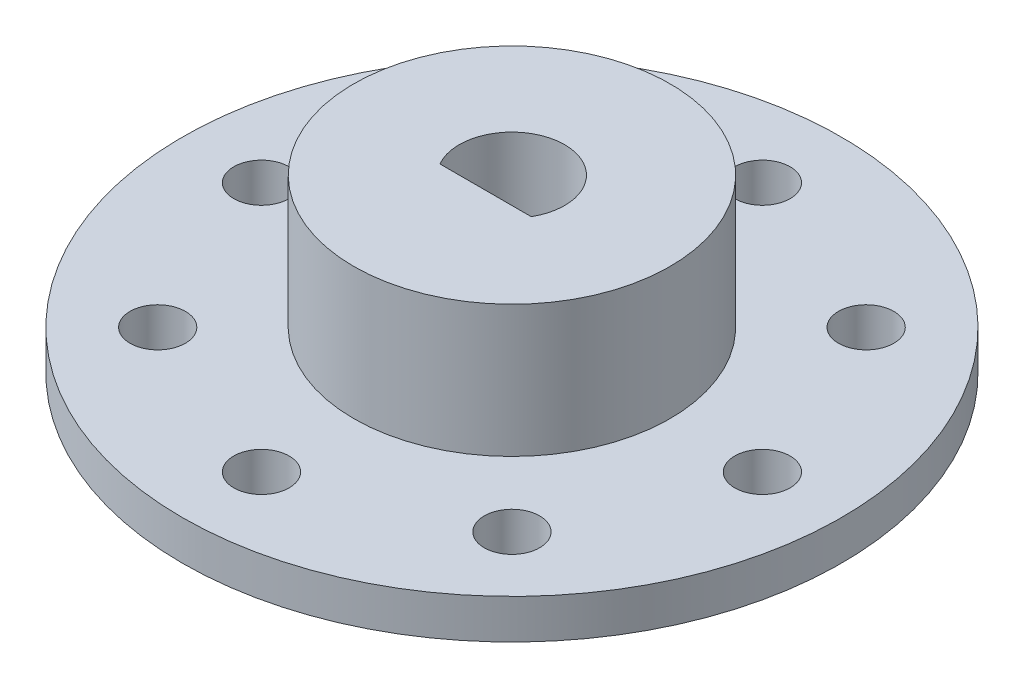
ISO-10303-21;
HEADER;
FILE_DESCRIPTION(('STEP AP214'),'2;1');
FILE_NAME('part.step','',(''),(''),'','','');
FILE_SCHEMA(('AUTOMOTIVE_DESIGN { 1 0 10303 214 1 1 1 1 }'));
ENDSEC;
DATA;
#1=APPLICATION_CONTEXT('core data for automotive mechanical design processes');
#2=APPLICATION_PROTOCOL_DEFINITION('international standard','automotive_design',2000,#1);
#3=PRODUCT_CONTEXT('',#1,'mechanical');
#4=PRODUCT('Part','Part','',(#3));
#5=PRODUCT_RELATED_PRODUCT_CATEGORY('part','',(#4));
#6=PRODUCT_DEFINITION_FORMATION('','',#4);
#7=PRODUCT_DEFINITION_CONTEXT('part definition',#1,'design');
#8=PRODUCT_DEFINITION('design','',#6,#7);
#9=PRODUCT_DEFINITION_SHAPE('','',#8);
#10=(LENGTH_UNIT() NAMED_UNIT(*) SI_UNIT(.MILLI.,.METRE.));
#11=(NAMED_UNIT(*) PLANE_ANGLE_UNIT() SI_UNIT($,.RADIAN.));
#12=(NAMED_UNIT(*) SI_UNIT($,.STERADIAN.) SOLID_ANGLE_UNIT());
#13=UNCERTAINTY_MEASURE_WITH_UNIT(LENGTH_MEASURE(1.E-05),#10,'distance_accuracy_value','');
#14=(GEOMETRIC_REPRESENTATION_CONTEXT(3) GLOBAL_UNCERTAINTY_ASSIGNED_CONTEXT((#13)) GLOBAL_UNIT_ASSIGNED_CONTEXT((#10,
#11,#12)) REPRESENTATION_CONTEXT('',''));
#15=CARTESIAN_POINT('',(0.,0.,0.));
#16=DIRECTION('',(0.,0.,1.));
#17=DIRECTION('',(1.,0.,0.));
#18=AXIS2_PLACEMENT_3D('',#15,#16,#17);
#19=CARTESIAN_POINT('',(0.,3.,0.));
#20=DIRECTION('',(0.,1.,0.));
#21=DIRECTION('',(0.,0.,1.));
#22=AXIS2_PLACEMENT_3D('',#19,#20,#21);
#23=PLANE('',#22);
#24=CARTESIAN_POINT('',(-13.4350288425442,3.,-13.4350288425438));
#25=DIRECTION('',(0.,1.,0.));
#26=DIRECTION('',(0.,0.,1.));
#27=AXIS2_PLACEMENT_3D('',#24,#25,#26);
#28=CIRCLE('',#27,2.10000000000062);
#29=CARTESIAN_POINT('',(-13.4350288425442,3.,-11.3350288425432));
#30=VERTEX_POINT('',#29);
#31=EDGE_CURVE('E101',#30,#30,#28,.T.);
#32=ORIENTED_EDGE('',*,*,#31,.F.);
#33=EDGE_LOOP('',(#32));
#34=FACE_BOUND('',#33,.T.);
#35=CARTESIAN_POINT('',(-13.435028842543,3.,13.435028842545));
#36=DIRECTION('',(0.,1.,0.));
#37=DIRECTION('',(0.,0.,1.));
#38=AXIS2_PLACEMENT_3D('',#35,#36,#37);
#39=CIRCLE('',#38,2.10000000000164);
#40=CARTESIAN_POINT('',(-13.435028842543,3.,15.5350288425466));
#41=VERTEX_POINT('',#40);
#42=EDGE_CURVE('E117',#41,#41,#39,.T.);
#43=ORIENTED_EDGE('',*,*,#42,.F.);
#44=EDGE_LOOP('',(#43));
#45=FACE_BOUND('',#44,.T.);
#46=CARTESIAN_POINT('',(13.4350288425458,3.,13.4350288425438));
#47=DIRECTION('',(0.,1.,0.));
#48=DIRECTION('',(0.,0.,1.));
#49=AXIS2_PLACEMENT_3D('',#46,#47,#48);
#50=CIRCLE('',#49,2.10000000000125);
#51=CARTESIAN_POINT('',(13.4350288425458,3.,15.5350288425451));
#52=VERTEX_POINT('',#51);
#53=EDGE_CURVE('E133',#52,#52,#50,.T.);
#54=ORIENTED_EDGE('',*,*,#53,.F.);
#55=EDGE_LOOP('',(#54));
#56=FACE_BOUND('',#55,.T.);
#57=CARTESIAN_POINT('',(13.4350288425446,3.,-13.435028842545));
#58=DIRECTION('',(0.,1.,0.));
#59=DIRECTION('',(0.,0.,1.));
#60=AXIS2_PLACEMENT_3D('',#57,#58,#59);
#61=CIRCLE('',#60,2.1000000000001);
#62=CARTESIAN_POINT('',(13.4350288425446,3.,-11.3350288425449));
#63=VERTEX_POINT('',#62);
#64=EDGE_CURVE('E149',#63,#63,#61,.T.);
#65=ORIENTED_EDGE('',*,*,#64,.F.);
#66=EDGE_LOOP('',(#65));
#67=FACE_BOUND('',#66,.T.);
#68=CARTESIAN_POINT('',(0.,3.,0.));
#69=DIRECTION('',(0.,1.,0.));
#70=DIRECTION('',(0.,0.,1.));
#71=AXIS2_PLACEMENT_3D('',#68,#69,#70);
#72=CIRCLE('',#71,25.);
#73=CARTESIAN_POINT('',(0.,3.,25.));
#74=VERTEX_POINT('',#73);
#75=EDGE_CURVE('E11',#74,#74,#72,.T.);
#76=ORIENTED_EDGE('',*,*,#75,.T.);
#77=EDGE_LOOP('',(#76));
#78=FACE_BOUND('',#77,.T.);
#79=CARTESIAN_POINT('',(0.,3.,-19.));
#80=DIRECTION('',(0.,1.,0.));
#81=DIRECTION('',(0.,0.,1.));
#82=AXIS2_PLACEMENT_3D('',#79,#80,#81);
#83=CIRCLE('',#82,2.1);
#84=CARTESIAN_POINT('',(0.,3.,-16.9));
#85=VERTEX_POINT('',#84);
#86=EDGE_CURVE('E157',#85,#85,#83,.T.);
#87=ORIENTED_EDGE('',*,*,#86,.F.);
#88=EDGE_LOOP('',(#87));
#89=FACE_BOUND('',#88,.T.);
#90=CARTESIAN_POINT('',(19.0000000000008,3.,-8.07691889848134E-13));
#91=DIRECTION('',(0.,1.,0.));
#92=DIRECTION('',(0.,0.,1.));
#93=AXIS2_PLACEMENT_3D('',#90,#91,#92);
#94=CIRCLE('',#93,2.1000000000006);
#95=CARTESIAN_POINT('',(19.0000000000008,3.,2.09999999999979));
#96=VERTEX_POINT('',#95);
#97=EDGE_CURVE('E141',#96,#96,#94,.T.);
#98=ORIENTED_EDGE('',*,*,#97,.F.);
#99=EDGE_LOOP('',(#98));
#100=FACE_BOUND('',#99,.T.);
#101=CARTESIAN_POINT('',(1.61538377969627E-12,3.,19.));
#102=DIRECTION('',(0.,1.,0.));
#103=DIRECTION('',(0.,0.,1.));
#104=AXIS2_PLACEMENT_3D('',#101,#102,#103);
#105=CIRCLE('',#104,2.10000000000167);
#106=CARTESIAN_POINT('',(1.61538377969627E-12,3.,21.1000000000017));
#107=VERTEX_POINT('',#106);
#108=EDGE_CURVE('E125',#107,#107,#105,.T.);
#109=ORIENTED_EDGE('',*,*,#108,.F.);
#110=EDGE_LOOP('',(#109));
#111=FACE_BOUND('',#110,.T.);
#112=CARTESIAN_POINT('',(-18.9999999999992,3.,8.10018718766514E-13));
#113=DIRECTION('',(0.,1.,0.));
#114=DIRECTION('',(0.,0.,1.));
#115=AXIS2_PLACEMENT_3D('',#112,#113,#114);
#116=CIRCLE('',#115,2.1000000000012);
#117=CARTESIAN_POINT('',(-18.9999999999992,3.,2.10000000000201));
#118=VERTEX_POINT('',#117);
#119=EDGE_CURVE('E109',#118,#118,#116,.T.);
#120=ORIENTED_EDGE('',*,*,#119,.F.);
#121=EDGE_LOOP('',(#120));
#122=FACE_BOUND('',#121,.T.);
#123=CARTESIAN_POINT('',(0.,3.,0.));
#124=DIRECTION('',(0.,1.,0.));
#125=DIRECTION('',(0.,0.,1.));
#126=AXIS2_PLACEMENT_3D('',#123,#124,#125);
#127=CIRCLE('',#126,12.);
#128=CARTESIAN_POINT('',(0.,3.,12.));
#129=VERTEX_POINT('',#128);
#130=EDGE_CURVE('E74',#129,#129,#127,.T.);
#131=ORIENTED_EDGE('',*,*,#130,.F.);
#132=EDGE_LOOP('',(#131));
#133=FACE_BOUND('',#132,.T.);
#134=ADVANCED_FACE('F39',(#34,#45,#56,#67,#78,#89,#100,#111,#122,#133),#23,.T.);
#135=CARTESIAN_POINT('',(0.,0.,0.));
#136=DIRECTION('',(0.,1.,0.));
#137=DIRECTION('',(0.,0.,1.));
#138=AXIS2_PLACEMENT_3D('',#135,#136,#137);
#139=PLANE('',#138);
#140=DIRECTION('',(1.,0.,0.));
#141=VECTOR('',#140,1.);
#142=CARTESIAN_POINT('',(0.,0.,2.));
#143=LINE('',#142,#141);
#144=CARTESIAN_POINT('',(-3.46410161513775,0.,2.));
#145=VERTEX_POINT('',#144);
#146=CARTESIAN_POINT('',(3.46410161513775,0.,2.));
#147=VERTEX_POINT('',#146);
#148=EDGE_CURVE('E76',#145,#147,#143,.T.);
#149=ORIENTED_EDGE('',*,*,#148,.T.);
#150=CARTESIAN_POINT('',(0.,0.,0.));
#151=DIRECTION('',(0.,1.,0.));
#152=DIRECTION('',(0.,0.,1.));
#153=AXIS2_PLACEMENT_3D('',#150,#151,#152);
#154=CIRCLE('',#153,4.);
#155=EDGE_CURVE('E68',#147,#145,#154,.T.);
#156=ORIENTED_EDGE('',*,*,#155,.T.);
#157=EDGE_LOOP('',(#149,#156));
#158=FACE_BOUND('',#157,.T.);
#159=CARTESIAN_POINT('',(0.,0.,0.));
#160=DIRECTION('',(0.,1.,0.));
#161=DIRECTION('',(0.,0.,1.));
#162=AXIS2_PLACEMENT_3D('',#159,#160,#161);
#163=CIRCLE('',#162,25.);
#164=CARTESIAN_POINT('',(0.,0.,25.));
#165=VERTEX_POINT('',#164);
#166=EDGE_CURVE('E43',#165,#165,#163,.T.);
#167=ORIENTED_EDGE('',*,*,#166,.F.);
#168=EDGE_LOOP('',(#167));
#169=FACE_BOUND('',#168,.T.);
#170=CARTESIAN_POINT('',(0.,0.,-19.));
#171=DIRECTION('',(0.,1.,0.));
#172=DIRECTION('',(0.,0.,1.));
#173=AXIS2_PLACEMENT_3D('',#170,#171,#172);
#174=CIRCLE('',#173,2.1);
#175=CARTESIAN_POINT('',(0.,0.,-16.9));
#176=VERTEX_POINT('',#175);
#177=EDGE_CURVE('E153',#176,#176,#174,.T.);
#178=ORIENTED_EDGE('',*,*,#177,.T.);
#179=EDGE_LOOP('',(#178));
#180=FACE_BOUND('',#179,.T.);
#181=CARTESIAN_POINT('',(13.4350288425446,0.,-13.435028842545));
#182=DIRECTION('',(0.,1.,0.));
#183=DIRECTION('',(0.,0.,1.));
#184=AXIS2_PLACEMENT_3D('',#181,#182,#183);
#185=CIRCLE('',#184,2.1000000000001);
#186=CARTESIAN_POINT('',(13.4350288425446,0.,-11.3350288425449));
#187=VERTEX_POINT('',#186);
#188=EDGE_CURVE('E145',#187,#187,#185,.T.);
#189=ORIENTED_EDGE('',*,*,#188,.T.);
#190=EDGE_LOOP('',(#189));
#191=FACE_BOUND('',#190,.T.);
#192=CARTESIAN_POINT('',(19.0000000000008,0.,-8.07691889848134E-13));
#193=DIRECTION('',(0.,1.,0.));
#194=DIRECTION('',(0.,0.,1.));
#195=AXIS2_PLACEMENT_3D('',#192,#193,#194);
#196=CIRCLE('',#195,2.1000000000006);
#197=CARTESIAN_POINT('',(19.0000000000008,0.,2.09999999999979));
#198=VERTEX_POINT('',#197);
#199=EDGE_CURVE('E137',#198,#198,#196,.T.);
#200=ORIENTED_EDGE('',*,*,#199,.T.);
#201=EDGE_LOOP('',(#200));
#202=FACE_BOUND('',#201,.T.);
#203=CARTESIAN_POINT('',(13.4350288425458,0.,13.4350288425438));
#204=DIRECTION('',(0.,1.,0.));
#205=DIRECTION('',(0.,0.,1.));
#206=AXIS2_PLACEMENT_3D('',#203,#204,#205);
#207=CIRCLE('',#206,2.10000000000125);
#208=CARTESIAN_POINT('',(13.4350288425458,0.,15.5350288425451));
#209=VERTEX_POINT('',#208);
#210=EDGE_CURVE('E129',#209,#209,#207,.T.);
#211=ORIENTED_EDGE('',*,*,#210,.T.);
#212=EDGE_LOOP('',(#211));
#213=FACE_BOUND('',#212,.T.);
#214=CARTESIAN_POINT('',(1.61538377969627E-12,0.,19.));
#215=DIRECTION('',(0.,1.,0.));
#216=DIRECTION('',(0.,0.,1.));
#217=AXIS2_PLACEMENT_3D('',#214,#215,#216);
#218=CIRCLE('',#217,2.10000000000167);
#219=CARTESIAN_POINT('',(1.61538377969627E-12,0.,21.1000000000017));
#220=VERTEX_POINT('',#219);
#221=EDGE_CURVE('E121',#220,#220,#218,.T.);
#222=ORIENTED_EDGE('',*,*,#221,.T.);
#223=EDGE_LOOP('',(#222));
#224=FACE_BOUND('',#223,.T.);
#225=CARTESIAN_POINT('',(-13.435028842543,0.,13.435028842545));
#226=DIRECTION('',(0.,1.,0.));
#227=DIRECTION('',(0.,0.,1.));
#228=AXIS2_PLACEMENT_3D('',#225,#226,#227);
#229=CIRCLE('',#228,2.10000000000164);
#230=CARTESIAN_POINT('',(-13.435028842543,0.,15.5350288425466));
#231=VERTEX_POINT('',#230);
#232=EDGE_CURVE('E113',#231,#231,#229,.T.);
#233=ORIENTED_EDGE('',*,*,#232,.T.);
#234=EDGE_LOOP('',(#233));
#235=FACE_BOUND('',#234,.T.);
#236=CARTESIAN_POINT('',(-18.9999999999992,0.,8.10018718766514E-13));
#237=DIRECTION('',(0.,1.,0.));
#238=DIRECTION('',(0.,0.,1.));
#239=AXIS2_PLACEMENT_3D('',#236,#237,#238);
#240=CIRCLE('',#239,2.1000000000012);
#241=CARTESIAN_POINT('',(-18.9999999999992,0.,2.10000000000201));
#242=VERTEX_POINT('',#241);
#243=EDGE_CURVE('E105',#242,#242,#240,.T.);
#244=ORIENTED_EDGE('',*,*,#243,.T.);
#245=EDGE_LOOP('',(#244));
#246=FACE_BOUND('',#245,.T.);
#247=CARTESIAN_POINT('',(-13.4350288425442,0.,-13.4350288425438));
#248=DIRECTION('',(0.,1.,0.));
#249=DIRECTION('',(0.,0.,1.));
#250=AXIS2_PLACEMENT_3D('',#247,#248,#249);
#251=CIRCLE('',#250,2.10000000000062);
#252=CARTESIAN_POINT('',(-13.4350288425442,0.,-11.3350288425432));
#253=VERTEX_POINT('',#252);
#254=EDGE_CURVE('E97',#253,#253,#251,.T.);
#255=ORIENTED_EDGE('',*,*,#254,.T.);
#256=EDGE_LOOP('',(#255));
#257=FACE_BOUND('',#256,.T.);
#258=ADVANCED_FACE('F81',(#158,#169,#180,#191,#202,#213,#224,#235,#246,#257),#139,.F.);
#259=CARTESIAN_POINT('',(0.,3.,0.));
#260=DIRECTION('',(0.,-1.,0.));
#261=DIRECTION('',(0.,0.,-1.));
#262=AXIS2_PLACEMENT_3D('',#259,#260,#261);
#263=CYLINDRICAL_SURFACE('',#262,25.);
#264=ORIENTED_EDGE('',*,*,#75,.F.);
#265=EDGE_LOOP('',(#264));
#266=FACE_BOUND('',#265,.T.);
#267=ORIENTED_EDGE('',*,*,#166,.T.);
#268=EDGE_LOOP('',(#267));
#269=FACE_BOUND('',#268,.T.);
#270=ADVANCED_FACE('F41',(#266,#269),#263,.T.);
#271=CARTESIAN_POINT('',(0.,3.,-19.));
#272=DIRECTION('',(0.,-1.,0.));
#273=DIRECTION('',(0.,0.,-1.));
#274=AXIS2_PLACEMENT_3D('',#271,#272,#273);
#275=CYLINDRICAL_SURFACE('',#274,2.1);
#276=ORIENTED_EDGE('',*,*,#86,.T.);
#277=EDGE_LOOP('',(#276));
#278=FACE_BOUND('',#277,.T.);
#279=ORIENTED_EDGE('',*,*,#177,.F.);
#280=EDGE_LOOP('',(#279));
#281=FACE_BOUND('',#280,.T.);
#282=ADVANCED_FACE('F167',(#278,#281),#275,.F.);
#283=CARTESIAN_POINT('',(13.4350288425446,3.,-13.435028842545));
#284=DIRECTION('',(0.,-1.,0.));
#285=DIRECTION('',(0.,0.,-1.));
#286=AXIS2_PLACEMENT_3D('',#283,#284,#285);
#287=CYLINDRICAL_SURFACE('',#286,2.1000000000001);
#288=ORIENTED_EDGE('',*,*,#64,.T.);
#289=EDGE_LOOP('',(#288));
#290=FACE_BOUND('',#289,.T.);
#291=ORIENTED_EDGE('',*,*,#188,.F.);
#292=EDGE_LOOP('',(#291));
#293=FACE_BOUND('',#292,.T.);
#294=ADVANCED_FACE('F169',(#290,#293),#287,.F.);
#295=CARTESIAN_POINT('',(19.0000000000008,3.,-8.07691889848134E-13));
#296=DIRECTION('',(0.,-1.,0.));
#297=DIRECTION('',(0.,0.,-1.));
#298=AXIS2_PLACEMENT_3D('',#295,#296,#297);
#299=CYLINDRICAL_SURFACE('',#298,2.1000000000006);
#300=ORIENTED_EDGE('',*,*,#97,.T.);
#301=EDGE_LOOP('',(#300));
#302=FACE_BOUND('',#301,.T.);
#303=ORIENTED_EDGE('',*,*,#199,.F.);
#304=EDGE_LOOP('',(#303));
#305=FACE_BOUND('',#304,.T.);
#306=ADVANCED_FACE('F176',(#302,#305),#299,.F.);
#307=CARTESIAN_POINT('',(13.4350288425458,3.,13.4350288425438));
#308=DIRECTION('',(0.,-1.,0.));
#309=DIRECTION('',(0.,0.,-1.));
#310=AXIS2_PLACEMENT_3D('',#307,#308,#309);
#311=CYLINDRICAL_SURFACE('',#310,2.10000000000125);
#312=ORIENTED_EDGE('',*,*,#53,.T.);
#313=EDGE_LOOP('',(#312));
#314=FACE_BOUND('',#313,.T.);
#315=ORIENTED_EDGE('',*,*,#210,.F.);
#316=EDGE_LOOP('',(#315));
#317=FACE_BOUND('',#316,.T.);
#318=ADVANCED_FACE('F235',(#314,#317),#311,.F.);
#319=CARTESIAN_POINT('',(1.61538377969627E-12,3.,19.));
#320=DIRECTION('',(0.,-1.,0.));
#321=DIRECTION('',(0.,0.,-1.));
#322=AXIS2_PLACEMENT_3D('',#319,#320,#321);
#323=CYLINDRICAL_SURFACE('',#322,2.10000000000167);
#324=ORIENTED_EDGE('',*,*,#108,.T.);
#325=EDGE_LOOP('',(#324));
#326=FACE_BOUND('',#325,.T.);
#327=ORIENTED_EDGE('',*,*,#221,.F.);
#328=EDGE_LOOP('',(#327));
#329=FACE_BOUND('',#328,.T.);
#330=ADVANCED_FACE('F231',(#326,#329),#323,.F.);
#331=CARTESIAN_POINT('',(-13.435028842543,3.,13.435028842545));
#332=DIRECTION('',(0.,-1.,0.));
#333=DIRECTION('',(0.,0.,-1.));
#334=AXIS2_PLACEMENT_3D('',#331,#332,#333);
#335=CYLINDRICAL_SURFACE('',#334,2.10000000000164);
#336=ORIENTED_EDGE('',*,*,#42,.T.);
#337=EDGE_LOOP('',(#336));
#338=FACE_BOUND('',#337,.T.);
#339=ORIENTED_EDGE('',*,*,#232,.F.);
#340=EDGE_LOOP('',(#339));
#341=FACE_BOUND('',#340,.T.);
#342=ADVANCED_FACE('F227',(#338,#341),#335,.F.);
#343=CARTESIAN_POINT('',(-18.9999999999992,3.,8.10018718766514E-13));
#344=DIRECTION('',(0.,-1.,0.));
#345=DIRECTION('',(0.,0.,-1.));
#346=AXIS2_PLACEMENT_3D('',#343,#344,#345);
#347=CYLINDRICAL_SURFACE('',#346,2.1000000000012);
#348=ORIENTED_EDGE('',*,*,#119,.T.);
#349=EDGE_LOOP('',(#348));
#350=FACE_BOUND('',#349,.T.);
#351=ORIENTED_EDGE('',*,*,#243,.F.);
#352=EDGE_LOOP('',(#351));
#353=FACE_BOUND('',#352,.T.);
#354=ADVANCED_FACE('F223',(#350,#353),#347,.F.);
#355=CARTESIAN_POINT('',(-13.4350288425442,3.,-13.4350288425438));
#356=DIRECTION('',(0.,-1.,0.));
#357=DIRECTION('',(0.,0.,-1.));
#358=AXIS2_PLACEMENT_3D('',#355,#356,#357);
#359=CYLINDRICAL_SURFACE('',#358,2.10000000000062);
#360=ORIENTED_EDGE('',*,*,#31,.T.);
#361=EDGE_LOOP('',(#360));
#362=FACE_BOUND('',#361,.T.);
#363=ORIENTED_EDGE('',*,*,#254,.F.);
#364=EDGE_LOOP('',(#363));
#365=FACE_BOUND('',#364,.T.);
#366=ADVANCED_FACE('F216',(#362,#365),#359,.F.);
#367=CARTESIAN_POINT('',(0.,13.,0.));
#368=DIRECTION('',(0.,1.,0.));
#369=DIRECTION('',(0.,0.,1.));
#370=AXIS2_PLACEMENT_3D('',#367,#368,#369);
#371=PLANE('',#370);
#372=CARTESIAN_POINT('',(0.,13.,0.));
#373=DIRECTION('',(0.,1.,0.));
#374=DIRECTION('',(0.,0.,1.));
#375=AXIS2_PLACEMENT_3D('',#372,#373,#374);
#376=CIRCLE('',#375,12.);
#377=CARTESIAN_POINT('',(0.,13.,12.));
#378=VERTEX_POINT('',#377);
#379=EDGE_CURVE('E93',#378,#378,#376,.T.);
#380=ORIENTED_EDGE('',*,*,#379,.T.);
#381=EDGE_LOOP('',(#380));
#382=FACE_BOUND('',#381,.T.);
#383=DIRECTION('',(1.,0.,0.));
#384=VECTOR('',#383,1.);
#385=CARTESIAN_POINT('',(-3.46410161513775,13.,2.));
#386=LINE('',#385,#384);
#387=CARTESIAN_POINT('',(-3.46410161513775,13.,2.));
#388=VERTEX_POINT('',#387);
#389=CARTESIAN_POINT('',(3.46410161513775,13.,2.));
#390=VERTEX_POINT('',#389);
#391=EDGE_CURVE('E86',#388,#390,#386,.T.);
#392=ORIENTED_EDGE('',*,*,#391,.F.);
#393=CARTESIAN_POINT('',(0.,13.,0.));
#394=DIRECTION('',(0.,1.,0.));
#395=DIRECTION('',(0.,0.,1.));
#396=AXIS2_PLACEMENT_3D('',#393,#394,#395);
#397=CIRCLE('',#396,4.);
#398=EDGE_CURVE('E71',#390,#388,#397,.T.);
#399=ORIENTED_EDGE('',*,*,#398,.F.);
#400=EDGE_LOOP('',(#392,#399));
#401=FACE_BOUND('',#400,.T.);
#402=ADVANCED_FACE('F208',(#382,#401),#371,.T.);
#403=CARTESIAN_POINT('',(0.,13.,0.));
#404=DIRECTION('',(0.,-1.,0.));
#405=DIRECTION('',(0.,0.,-1.));
#406=AXIS2_PLACEMENT_3D('',#403,#404,#405);
#407=CYLINDRICAL_SURFACE('',#406,12.);
#408=ORIENTED_EDGE('',*,*,#379,.F.);
#409=EDGE_LOOP('',(#408));
#410=FACE_BOUND('',#409,.T.);
#411=ORIENTED_EDGE('',*,*,#130,.T.);
#412=EDGE_LOOP('',(#411));
#413=FACE_BOUND('',#412,.T.);
#414=ADVANCED_FACE('F206',(#410,#413),#407,.T.);
#415=CARTESIAN_POINT('',(0.,13.,0.));
#416=DIRECTION('',(0.,-1.,0.));
#417=DIRECTION('',(0.,0.,-1.));
#418=AXIS2_PLACEMENT_3D('',#415,#416,#417);
#419=CYLINDRICAL_SURFACE('',#418,4.);
#420=DIRECTION('',(0.,-1.,0.));
#421=VECTOR('',#420,1.);
#422=CARTESIAN_POINT('',(-3.46410161513775,13.,2.));
#423=LINE('',#422,#421);
#424=EDGE_CURVE('E60',#388,#145,#423,.T.);
#425=ORIENTED_EDGE('',*,*,#424,.T.);
#426=ORIENTED_EDGE('',*,*,#155,.F.);
#427=DIRECTION('',(0.,-1.,0.));
#428=VECTOR('',#427,1.);
#429=CARTESIAN_POINT('',(3.46410161513775,13.,2.));
#430=LINE('',#429,#428);
#431=EDGE_CURVE('E55',#390,#147,#430,.T.);
#432=ORIENTED_EDGE('',*,*,#431,.F.);
#433=ORIENTED_EDGE('',*,*,#398,.T.);
#434=EDGE_LOOP('',(#425,#426,#432,#433));
#435=FACE_BOUND('',#434,.T.);
#436=ADVANCED_FACE('F66',(#435),#419,.F.);
#437=CARTESIAN_POINT('',(-3.46410161513775,13.,2.));
#438=DIRECTION('',(0.,0.,-1.));
#439=DIRECTION('',(-1.,0.,0.));
#440=AXIS2_PLACEMENT_3D('',#437,#438,#439);
#441=PLANE('',#440);
#442=ORIENTED_EDGE('',*,*,#431,.T.);
#443=ORIENTED_EDGE('',*,*,#148,.F.);
#444=ORIENTED_EDGE('',*,*,#424,.F.);
#445=ORIENTED_EDGE('',*,*,#391,.T.);
#446=EDGE_LOOP('',(#442,#443,#444,#445));
#447=FACE_BOUND('',#446,.T.);
#448=ADVANCED_FACE('F77',(#447),#441,.T.);
#449=CLOSED_SHELL('',(#134,#258,#270,#282,#294,#306,#318,#330,#342,#354,#366,#402,#414,#436,#448));
#450=MANIFOLD_SOLID_BREP('B2',#449);
#451=ADVANCED_BREP_SHAPE_REPRESENTATION('',(#18,#450),#14);
#452=SHAPE_DEFINITION_REPRESENTATION(#9,#451);
ENDSEC;
END-ISO-10303-21;
